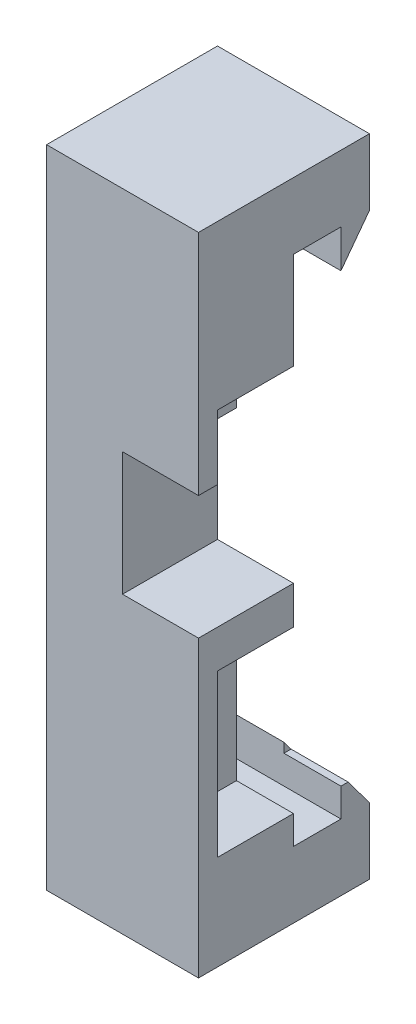
ISO-10303-21;
HEADER;
FILE_DESCRIPTION(('STEP AP214'),'2;1');
FILE_NAME('part.step','',(''),(''),'','','');
FILE_SCHEMA(('AUTOMOTIVE_DESIGN { 1 0 10303 214 1 1 1 1 }'));
ENDSEC;
DATA;
#1=APPLICATION_CONTEXT('core data for automotive mechanical design processes');
#2=APPLICATION_PROTOCOL_DEFINITION('international standard','automotive_design',2000,#1);
#3=PRODUCT_CONTEXT('',#1,'mechanical');
#4=PRODUCT('Part','Part','',(#3));
#5=PRODUCT_RELATED_PRODUCT_CATEGORY('part','',(#4));
#6=PRODUCT_DEFINITION_FORMATION('','',#4);
#7=PRODUCT_DEFINITION_CONTEXT('part definition',#1,'design');
#8=PRODUCT_DEFINITION('design','',#6,#7);
#9=PRODUCT_DEFINITION_SHAPE('','',#8);
#10=(LENGTH_UNIT() NAMED_UNIT(*) SI_UNIT(.MILLI.,.METRE.));
#11=(NAMED_UNIT(*) PLANE_ANGLE_UNIT() SI_UNIT($,.RADIAN.));
#12=(NAMED_UNIT(*) SI_UNIT($,.STERADIAN.) SOLID_ANGLE_UNIT());
#13=UNCERTAINTY_MEASURE_WITH_UNIT(LENGTH_MEASURE(1.E-05),#10,'distance_accuracy_value','');
#14=(GEOMETRIC_REPRESENTATION_CONTEXT(3) GLOBAL_UNCERTAINTY_ASSIGNED_CONTEXT((#13)) GLOBAL_UNIT_ASSIGNED_CONTEXT((#10,
#11,#12)) REPRESENTATION_CONTEXT('',''));
#15=CARTESIAN_POINT('',(0.,0.,0.));
#16=DIRECTION('',(0.,0.,1.));
#17=DIRECTION('',(1.,0.,0.));
#18=AXIS2_PLACEMENT_3D('',#15,#16,#17);
#19=CARTESIAN_POINT('',(2.5,3.75,0.));
#20=DIRECTION('',(-1.,0.,0.));
#21=DIRECTION('',(0.,0.,1.));
#22=AXIS2_PLACEMENT_3D('',#19,#20,#21);
#23=PLANE('',#22);
#24=DIRECTION('',(0.,0.,1.));
#25=VECTOR('',#24,1.);
#26=CARTESIAN_POINT('',(2.5,6.75,0.197224362268007));
#27=LINE('',#26,#25);
#28=CARTESIAN_POINT('',(2.5,6.75,2.));
#29=VERTEX_POINT('',#28);
#30=CARTESIAN_POINT('',(2.5,6.75,4.));
#31=VERTEX_POINT('',#30);
#32=EDGE_CURVE('E221',#29,#31,#27,.T.);
#33=ORIENTED_EDGE('',*,*,#32,.T.);
#34=DIRECTION('',(0.,-1.,0.));
#35=VECTOR('',#34,1.);
#36=CARTESIAN_POINT('',(2.5,3.75,4.));
#37=LINE('',#36,#35);
#38=CARTESIAN_POINT('',(2.5,2.5,4.));
#39=VERTEX_POINT('',#38);
#40=EDGE_CURVE('E269',#31,#39,#37,.T.);
#41=ORIENTED_EDGE('',*,*,#40,.T.);
#42=DIRECTION('',(0.,0.,1.));
#43=VECTOR('',#42,1.);
#44=CARTESIAN_POINT('',(2.5,2.5,0.));
#45=LINE('',#44,#43);
#46=CARTESIAN_POINT('',(2.5,2.5,2.));
#47=VERTEX_POINT('',#46);
#48=EDGE_CURVE('E344',#47,#39,#45,.T.);
#49=ORIENTED_EDGE('',*,*,#48,.F.);
#50=DIRECTION('',(0.,1.,0.));
#51=VECTOR('',#50,1.);
#52=CARTESIAN_POINT('',(2.5,3.75,2.));
#53=LINE('',#52,#51);
#54=EDGE_CURVE('E48',#47,#29,#53,.T.);
#55=ORIENTED_EDGE('',*,*,#54,.T.);
#56=EDGE_LOOP('',(#33,#41,#49,#55));
#57=FACE_BOUND('',#56,.T.);
#58=ADVANCED_FACE('F33',(#57),#23,.F.);
#59=CARTESIAN_POINT('',(2.,3.75,4.));
#60=DIRECTION('',(0.,0.,-1.));
#61=DIRECTION('',(-1.,0.,0.));
#62=AXIS2_PLACEMENT_3D('',#59,#60,#61);
#63=PLANE('',#62);
#64=ORIENTED_EDGE('',*,*,#40,.F.);
#65=DIRECTION('',(-1.,0.,0.));
#66=VECTOR('',#65,1.);
#67=CARTESIAN_POINT('',(2.5,6.75,4.));
#68=LINE('',#67,#66);
#69=CARTESIAN_POINT('',(4.,6.75,4.));
#70=VERTEX_POINT('',#69);
#71=EDGE_CURVE('E56',#70,#31,#68,.T.);
#72=ORIENTED_EDGE('',*,*,#71,.F.);
#73=DIRECTION('',(0.,1.,0.));
#74=VECTOR('',#73,1.);
#75=CARTESIAN_POINT('',(4.,3.75,4.));
#76=LINE('',#75,#74);
#77=CARTESIAN_POINT('',(4.,2.5,4.));
#78=VERTEX_POINT('',#77);
#79=EDGE_CURVE('E219',#78,#70,#76,.T.);
#80=ORIENTED_EDGE('',*,*,#79,.F.);
#81=DIRECTION('',(1.,0.,0.));
#82=VECTOR('',#81,1.);
#83=CARTESIAN_POINT('',(2.,2.5,4.));
#84=LINE('',#83,#82);
#85=EDGE_CURVE('E267',#39,#78,#84,.T.);
#86=ORIENTED_EDGE('',*,*,#85,.F.);
#87=EDGE_LOOP('',(#64,#72,#80,#86));
#88=FACE_BOUND('',#87,.T.);
#89=ADVANCED_FACE('F426',(#88),#63,.T.);
#90=CARTESIAN_POINT('',(4.,0.,6.));
#91=DIRECTION('',(-1.,0.,0.));
#92=DIRECTION('',(0.,0.,1.));
#93=AXIS2_PLACEMENT_3D('',#90,#91,#92);
#94=PLANE('',#93);
#95=DIRECTION('',(0.,0.,1.));
#96=VECTOR('',#95,1.);
#97=CARTESIAN_POINT('',(4.,7.75,0.));
#98=LINE('',#97,#96);
#99=CARTESIAN_POINT('',(4.,7.75,2.));
#100=VERTEX_POINT('',#99);
#101=CARTESIAN_POINT('',(4.,7.75,4.5));
#102=VERTEX_POINT('',#101);
#103=EDGE_CURVE('E345',#100,#102,#98,.T.);
#104=ORIENTED_EDGE('',*,*,#103,.T.);
#105=DIRECTION('',(0.,1.,0.));
#106=VECTOR('',#105,1.);
#107=CARTESIAN_POINT('',(4.,17.,4.5));
#108=LINE('',#107,#106);
#109=CARTESIAN_POINT('',(4.,0.,4.5));
#110=VERTEX_POINT('',#109);
#111=EDGE_CURVE('E227',#110,#102,#108,.T.);
#112=ORIENTED_EDGE('',*,*,#111,.F.);
#113=DIRECTION('',(0.,0.,-1.));
#114=VECTOR('',#113,1.);
#115=CARTESIAN_POINT('',(4.,0.,6.));
#116=LINE('',#115,#114);
#117=CARTESIAN_POINT('',(4.,0.,0.));
#118=VERTEX_POINT('',#117);
#119=EDGE_CURVE('E380',#110,#118,#116,.T.);
#120=ORIENTED_EDGE('',*,*,#119,.T.);
#121=DIRECTION('',(0.,1.,0.));
#122=VECTOR('',#121,1.);
#123=CARTESIAN_POINT('',(4.,0.,0.));
#124=LINE('',#123,#122);
#125=CARTESIAN_POINT('',(4.,1.75,0.));
#126=VERTEX_POINT('',#125);
#127=EDGE_CURVE('E370',#118,#126,#124,.T.);
#128=ORIENTED_EDGE('',*,*,#127,.T.);
#129=DIRECTION('',(0.,0.799999999999999,0.600000000000001));
#130=VECTOR('',#129,1.);
#131=CARTESIAN_POINT('',(4.,1.75,0.));
#132=LINE('',#131,#130);
#133=CARTESIAN_POINT('',(4.,2.5,0.562500000000002));
#134=VERTEX_POINT('',#133);
#135=EDGE_CURVE('E272',#126,#134,#132,.T.);
#136=ORIENTED_EDGE('',*,*,#135,.T.);
#137=DIRECTION('',(0.,0.,1.));
#138=VECTOR('',#137,1.);
#139=CARTESIAN_POINT('',(4.,2.5,0.));
#140=LINE('',#139,#138);
#141=CARTESIAN_POINT('',(4.,2.5,0.750000000000002));
#142=VERTEX_POINT('',#141);
#143=EDGE_CURVE('E357',#134,#142,#140,.T.);
#144=ORIENTED_EDGE('',*,*,#143,.T.);
#145=DIRECTION('',(0.,-1.,0.));
#146=VECTOR('',#145,1.);
#147=CARTESIAN_POINT('',(4.,2.75,0.750000000000002));
#148=LINE('',#147,#146);
#149=CARTESIAN_POINT('',(4.,1.75,0.750000000000002));
#150=VERTEX_POINT('',#149);
#151=EDGE_CURVE('E275',#142,#150,#148,.T.);
#152=ORIENTED_EDGE('',*,*,#151,.T.);
#153=DIRECTION('',(0.,0.,1.));
#154=VECTOR('',#153,1.);
#155=CARTESIAN_POINT('',(4.,1.75,0.750000000000002));
#156=LINE('',#155,#154);
#157=CARTESIAN_POINT('',(4.,1.75,2.));
#158=VERTEX_POINT('',#157);
#159=EDGE_CURVE('E279',#150,#158,#156,.T.);
#160=ORIENTED_EDGE('',*,*,#159,.T.);
#161=DIRECTION('',(0.,1.,0.));
#162=VECTOR('',#161,1.);
#163=CARTESIAN_POINT('',(4.,15.25,2.));
#164=LINE('',#163,#162);
#165=CARTESIAN_POINT('',(4.,2.5,2.));
#166=VERTEX_POINT('',#165);
#167=EDGE_CURVE('E283',#158,#166,#164,.T.);
#168=ORIENTED_EDGE('',*,*,#167,.T.);
#169=EDGE_CURVE('E358',#166,#78,#140,.T.);
#170=ORIENTED_EDGE('',*,*,#169,.T.);
#171=ORIENTED_EDGE('',*,*,#79,.T.);
#172=DIRECTION('',(0.,0.,1.));
#173=VECTOR('',#172,1.);
#174=CARTESIAN_POINT('',(4.,6.75,0.197224362268007));
#175=LINE('',#174,#173);
#176=CARTESIAN_POINT('',(4.,6.75,2.));
#177=VERTEX_POINT('',#176);
#178=EDGE_CURVE('E216',#177,#70,#175,.T.);
#179=ORIENTED_EDGE('',*,*,#178,.F.);
#180=DIRECTION('',(0.,1.,0.));
#181=VECTOR('',#180,1.);
#182=CARTESIAN_POINT('',(4.,7.75,2.));
#183=LINE('',#182,#181);
#184=EDGE_CURVE('E201',#177,#100,#183,.T.);
#185=ORIENTED_EDGE('',*,*,#184,.T.);
#186=EDGE_LOOP('',(#104,#112,#120,#128,#136,#144,#152,#160,#168,#170,#171,#179,#185));
#187=FACE_BOUND('',#186,.T.);
#188=ADVANCED_FACE('F217',(#187),#94,.F.);
#189=CARTESIAN_POINT('',(0.,0.,0.));
#190=DIRECTION('',(0.,0.,-1.));
#191=DIRECTION('',(-1.,0.,0.));
#192=AXIS2_PLACEMENT_3D('',#189,#190,#191);
#193=PLANE('',#192);
#194=DIRECTION('',(-1.,0.,0.));
#195=VECTOR('',#194,1.);
#196=CARTESIAN_POINT('',(4.,15.25,0.));
#197=LINE('',#196,#195);
#198=CARTESIAN_POINT('',(4.,15.25,0.));
#199=VERTEX_POINT('',#198);
#200=CARTESIAN_POINT('',(0.,15.25,0.));
#201=VERTEX_POINT('',#200);
#202=EDGE_CURVE('E314',#199,#201,#197,.T.);
#203=ORIENTED_EDGE('',*,*,#202,.T.);
#204=DIRECTION('',(0.,-1.,0.));
#205=VECTOR('',#204,1.);
#206=CARTESIAN_POINT('',(0.,0.,0.));
#207=LINE('',#206,#205);
#208=CARTESIAN_POINT('',(0.,17.,0.));
#209=VERTEX_POINT('',#208);
#210=EDGE_CURVE('E363',#209,#201,#207,.T.);
#211=ORIENTED_EDGE('',*,*,#210,.F.);
#212=DIRECTION('',(-1.,0.,0.));
#213=VECTOR('',#212,1.);
#214=CARTESIAN_POINT('',(0.,17.,0.));
#215=LINE('',#214,#213);
#216=CARTESIAN_POINT('',(4.,17.,0.));
#217=VERTEX_POINT('',#216);
#218=EDGE_CURVE('E373',#217,#209,#215,.T.);
#219=ORIENTED_EDGE('',*,*,#218,.F.);
#220=EDGE_CURVE('E369',#199,#217,#124,.T.);
#221=ORIENTED_EDGE('',*,*,#220,.F.);
#222=EDGE_LOOP('',(#203,#211,#219,#221));
#223=FACE_BOUND('',#222,.T.);
#224=ADVANCED_FACE('F449',(#223),#193,.T.);
#225=CARTESIAN_POINT('',(4.,2.5,0.));
#226=DIRECTION('',(0.,-1.,0.));
#227=DIRECTION('',(0.,0.,-1.));
#228=AXIS2_PLACEMENT_3D('',#225,#226,#227);
#229=PLANE('',#228);
#230=ORIENTED_EDGE('',*,*,#48,.T.);
#231=ORIENTED_EDGE('',*,*,#85,.T.);
#232=ORIENTED_EDGE('',*,*,#169,.F.);
#233=DIRECTION('',(-1.,0.,0.));
#234=VECTOR('',#233,1.);
#235=CARTESIAN_POINT('',(4.,2.5,2.));
#236=LINE('',#235,#234);
#237=EDGE_CURVE('E335',#166,#47,#236,.T.);
#238=ORIENTED_EDGE('',*,*,#237,.T.);
#239=EDGE_LOOP('',(#230,#231,#232,#238));
#240=FACE_BOUND('',#239,.T.);
#241=ADVANCED_FACE('F424',(#240),#229,.F.);
#242=CARTESIAN_POINT('',(0.,0.,6.));
#243=DIRECTION('',(1.,0.,0.));
#244=DIRECTION('',(0.,0.,-1.));
#245=AXIS2_PLACEMENT_3D('',#242,#243,#244);
#246=PLANE('',#245);
#247=DIRECTION('',(0.,0.,-1.));
#248=VECTOR('',#247,1.);
#249=CARTESIAN_POINT('',(0.,0.,6.));
#250=LINE('',#249,#248);
#251=CARTESIAN_POINT('',(0.,0.,4.5));
#252=VERTEX_POINT('',#251);
#253=CARTESIAN_POINT('',(0.,0.,0.));
#254=VERTEX_POINT('',#253);
#255=EDGE_CURVE('E382',#252,#254,#250,.T.);
#256=ORIENTED_EDGE('',*,*,#255,.F.);
#257=DIRECTION('',(0.,1.,0.));
#258=VECTOR('',#257,1.);
#259=CARTESIAN_POINT('',(0.,0.,4.5));
#260=LINE('',#259,#258);
#261=CARTESIAN_POINT('',(0.,17.,4.5));
#262=VERTEX_POINT('',#261);
#263=EDGE_CURVE('E240',#252,#262,#260,.T.);
#264=ORIENTED_EDGE('',*,*,#263,.T.);
#265=DIRECTION('',(0.,0.,-1.));
#266=VECTOR('',#265,1.);
#267=CARTESIAN_POINT('',(0.,17.,6.));
#268=LINE('',#267,#266);
#269=EDGE_CURVE('E376',#262,#209,#268,.T.);
#270=ORIENTED_EDGE('',*,*,#269,.T.);
#271=ORIENTED_EDGE('',*,*,#210,.T.);
#272=DIRECTION('',(0.,0.799999999999999,-0.600000000000001));
#273=VECTOR('',#272,1.);
#274=CARTESIAN_POINT('',(0.,15.25,0.));
#275=LINE('',#274,#273);
#276=CARTESIAN_POINT('',(0.,14.25,0.750000000000002));
#277=VERTEX_POINT('',#276);
#278=EDGE_CURVE('E276',#277,#201,#275,.T.);
#279=ORIENTED_EDGE('',*,*,#278,.F.);
#280=DIRECTION('',(0.,-1.,0.));
#281=VECTOR('',#280,1.);
#282=CARTESIAN_POINT('',(0.,14.25,0.750000000000002));
#283=LINE('',#282,#281);
#284=CARTESIAN_POINT('',(0.,15.25,0.750000000000002));
#285=VERTEX_POINT('',#284);
#286=EDGE_CURVE('E310',#285,#277,#283,.T.);
#287=ORIENTED_EDGE('',*,*,#286,.F.);
#288=DIRECTION('',(0.,0.,-1.));
#289=VECTOR('',#288,1.);
#290=CARTESIAN_POINT('',(0.,15.25,0.750000000000002));
#291=LINE('',#290,#289);
#292=CARTESIAN_POINT('',(0.,15.25,2.));
#293=VERTEX_POINT('',#292);
#294=EDGE_CURVE('E307',#293,#285,#291,.T.);
#295=ORIENTED_EDGE('',*,*,#294,.F.);
#296=DIRECTION('',(0.,1.,0.));
#297=VECTOR('',#296,1.);
#298=CARTESIAN_POINT('',(0.,15.25,2.));
#299=LINE('',#298,#297);
#300=CARTESIAN_POINT('',(0.,1.75,2.));
#301=VERTEX_POINT('',#300);
#302=EDGE_CURVE('E304',#301,#293,#299,.T.);
#303=ORIENTED_EDGE('',*,*,#302,.F.);
#304=DIRECTION('',(0.,0.,1.));
#305=VECTOR('',#304,1.);
#306=CARTESIAN_POINT('',(0.,1.75,0.750000000000002));
#307=LINE('',#306,#305);
#308=CARTESIAN_POINT('',(0.,1.75,0.750000000000002));
#309=VERTEX_POINT('',#308);
#310=EDGE_CURVE('E301',#309,#301,#307,.T.);
#311=ORIENTED_EDGE('',*,*,#310,.F.);
#312=DIRECTION('',(0.,-1.,0.));
#313=VECTOR('',#312,1.);
#314=CARTESIAN_POINT('',(0.,2.75,0.750000000000002));
#315=LINE('',#314,#313);
#316=CARTESIAN_POINT('',(0.,2.75,0.750000000000002));
#317=VERTEX_POINT('',#316);
#318=EDGE_CURVE('E298',#317,#309,#315,.T.);
#319=ORIENTED_EDGE('',*,*,#318,.F.);
#320=DIRECTION('',(0.,0.799999999999999,0.600000000000001));
#321=VECTOR('',#320,1.);
#322=CARTESIAN_POINT('',(0.,1.75,0.));
#323=LINE('',#322,#321);
#324=CARTESIAN_POINT('',(0.,1.75,0.));
#325=VERTEX_POINT('',#324);
#326=EDGE_CURVE('E271',#325,#317,#323,.T.);
#327=ORIENTED_EDGE('',*,*,#326,.F.);
#328=EDGE_CURVE('E347',#325,#254,#207,.T.);
#329=ORIENTED_EDGE('',*,*,#328,.T.);
#330=EDGE_LOOP('',(#256,#264,#270,#271,#279,#287,#295,#303,#311,#319,#327,#329));
#331=FACE_BOUND('',#330,.T.);
#332=ADVANCED_FACE('F35',(#331),#246,.F.);
#333=CARTESIAN_POINT('',(0.,0.,6.));
#334=DIRECTION('',(0.,1.,0.));
#335=DIRECTION('',(0.,0.,1.));
#336=AXIS2_PLACEMENT_3D('',#333,#334,#335);
#337=PLANE('',#336);
#338=ORIENTED_EDGE('',*,*,#119,.F.);
#339=DIRECTION('',(1.,0.,0.));
#340=VECTOR('',#339,1.);
#341=CARTESIAN_POINT('',(-6.,0.,4.5));
#342=LINE('',#341,#340);
#343=EDGE_CURVE('E230',#252,#110,#342,.T.);
#344=ORIENTED_EDGE('',*,*,#343,.F.);
#345=ORIENTED_EDGE('',*,*,#255,.T.);
#346=DIRECTION('',(1.,0.,0.));
#347=VECTOR('',#346,1.);
#348=CARTESIAN_POINT('',(0.,0.,0.));
#349=LINE('',#348,#347);
#350=EDGE_CURVE('E366',#254,#118,#349,.T.);
#351=ORIENTED_EDGE('',*,*,#350,.T.);
#352=EDGE_LOOP('',(#338,#344,#345,#351));
#353=FACE_BOUND('',#352,.T.);
#354=ADVANCED_FACE('F456',(#353),#337,.F.);
#355=DIRECTION('',(0.,0.,-1.));
#356=VECTOR('',#355,1.);
#357=CARTESIAN_POINT('',(4.,17.,6.));
#358=LINE('',#357,#356);
#359=CARTESIAN_POINT('',(4.,17.,4.5));
#360=VERTEX_POINT('',#359);
#361=EDGE_CURVE('E378',#360,#217,#358,.T.);
#362=ORIENTED_EDGE('',*,*,#361,.F.);
#363=CARTESIAN_POINT('',(4.,11.,4.5));
#364=VERTEX_POINT('',#363);
#365=EDGE_CURVE('E213',#364,#360,#108,.T.);
#366=ORIENTED_EDGE('',*,*,#365,.F.);
#367=DIRECTION('',(0.,0.,1.));
#368=VECTOR('',#367,1.);
#369=CARTESIAN_POINT('',(4.,11.,0.));
#370=LINE('',#369,#368);
#371=CARTESIAN_POINT('',(4.,11.,4.));
#372=VERTEX_POINT('',#371);
#373=EDGE_CURVE('E354',#372,#364,#370,.T.);
#374=ORIENTED_EDGE('',*,*,#373,.F.);
#375=DIRECTION('',(0.,-1.,0.));
#376=VECTOR('',#375,1.);
#377=CARTESIAN_POINT('',(4.,11.,4.));
#378=LINE('',#377,#376);
#379=CARTESIAN_POINT('',(4.,12.7,4.));
#380=VERTEX_POINT('',#379);
#381=EDGE_CURVE('E244',#380,#372,#378,.T.);
#382=ORIENTED_EDGE('',*,*,#381,.F.);
#383=DIRECTION('',(0.,0.,-1.));
#384=VECTOR('',#383,1.);
#385=CARTESIAN_POINT('',(4.,12.7,4.));
#386=LINE('',#385,#384);
#387=CARTESIAN_POINT('',(4.,12.7,2.));
#388=VERTEX_POINT('',#387);
#389=EDGE_CURVE('E260',#380,#388,#386,.T.);
#390=ORIENTED_EDGE('',*,*,#389,.T.);
#391=CARTESIAN_POINT('',(4.,15.25,2.));
#392=VERTEX_POINT('',#391);
#393=EDGE_CURVE('E282',#388,#392,#164,.T.);
#394=ORIENTED_EDGE('',*,*,#393,.T.);
#395=DIRECTION('',(0.,0.,-1.));
#396=VECTOR('',#395,1.);
#397=CARTESIAN_POINT('',(4.,15.25,0.750000000000002));
#398=LINE('',#397,#396);
#399=CARTESIAN_POINT('',(4.,15.25,0.750000000000002));
#400=VERTEX_POINT('',#399);
#401=EDGE_CURVE('E286',#392,#400,#398,.T.);
#402=ORIENTED_EDGE('',*,*,#401,.T.);
#403=DIRECTION('',(0.,-1.,0.));
#404=VECTOR('',#403,1.);
#405=CARTESIAN_POINT('',(4.,14.25,0.750000000000002));
#406=LINE('',#405,#404);
#407=CARTESIAN_POINT('',(4.,14.25,0.750000000000002));
#408=VERTEX_POINT('',#407);
#409=EDGE_CURVE('E289',#400,#408,#406,.T.);
#410=ORIENTED_EDGE('',*,*,#409,.T.);
#411=DIRECTION('',(0.,0.799999999999999,-0.600000000000001));
#412=VECTOR('',#411,1.);
#413=CARTESIAN_POINT('',(4.,15.25,0.));
#414=LINE('',#413,#412);
#415=EDGE_CURVE('E292',#408,#199,#414,.T.);
#416=ORIENTED_EDGE('',*,*,#415,.T.);
#417=ORIENTED_EDGE('',*,*,#220,.T.);
#418=EDGE_LOOP('',(#362,#366,#374,#382,#390,#394,#402,#410,#416,#417));
#419=FACE_BOUND('',#418,.T.);
#420=ADVANCED_FACE('F462',(#419),#94,.F.);
#421=CARTESIAN_POINT('',(0.,17.,6.));
#422=DIRECTION('',(0.,-1.,0.));
#423=DIRECTION('',(0.,0.,-1.));
#424=AXIS2_PLACEMENT_3D('',#421,#422,#423);
#425=PLANE('',#424);
#426=ORIENTED_EDGE('',*,*,#269,.F.);
#427=DIRECTION('',(1.,0.,0.));
#428=VECTOR('',#427,1.);
#429=CARTESIAN_POINT('',(-6.,17.,4.5));
#430=LINE('',#429,#428);
#431=EDGE_CURVE('E229',#262,#360,#430,.T.);
#432=ORIENTED_EDGE('',*,*,#431,.T.);
#433=ORIENTED_EDGE('',*,*,#361,.T.);
#434=ORIENTED_EDGE('',*,*,#218,.T.);
#435=EDGE_LOOP('',(#426,#432,#433,#434));
#436=FACE_BOUND('',#435,.T.);
#437=ADVANCED_FACE('F448',(#436),#425,.F.);
#438=DIRECTION('',(-1.,0.,0.));
#439=VECTOR('',#438,1.);
#440=CARTESIAN_POINT('',(4.,1.75,0.));
#441=LINE('',#440,#439);
#442=EDGE_CURVE('E295',#126,#325,#441,.T.);
#443=ORIENTED_EDGE('',*,*,#442,.F.);
#444=ORIENTED_EDGE('',*,*,#127,.F.);
#445=ORIENTED_EDGE('',*,*,#350,.F.);
#446=ORIENTED_EDGE('',*,*,#328,.F.);
#447=EDGE_LOOP('',(#443,#444,#445,#446));
#448=FACE_BOUND('',#447,.T.);
#449=ADVANCED_FACE('F408',(#448),#193,.T.);
#450=CARTESIAN_POINT('',(2.5,2.5,0.562500000000002));
#451=VERTEX_POINT('',#450);
#452=CARTESIAN_POINT('',(2.5,2.5,0.750000000000002));
#453=VERTEX_POINT('',#452);
#454=EDGE_CURVE('E360',#451,#453,#45,.T.);
#455=ORIENTED_EDGE('',*,*,#454,.T.);
#456=DIRECTION('',(1.,0.,0.));
#457=VECTOR('',#456,1.);
#458=CARTESIAN_POINT('',(4.,2.5,0.750000000000002));
#459=LINE('',#458,#457);
#460=EDGE_CURVE('E341',#453,#142,#459,.T.);
#461=ORIENTED_EDGE('',*,*,#460,.T.);
#462=ORIENTED_EDGE('',*,*,#143,.F.);
#463=DIRECTION('',(-1.,0.,0.));
#464=VECTOR('',#463,1.);
#465=CARTESIAN_POINT('',(4.,2.5,0.562500000000002));
#466=LINE('',#465,#464);
#467=EDGE_CURVE('E338',#134,#451,#466,.T.);
#468=ORIENTED_EDGE('',*,*,#467,.T.);
#469=EDGE_LOOP('',(#455,#461,#462,#468));
#470=FACE_BOUND('',#469,.T.);
#471=ADVANCED_FACE('F397',(#470),#229,.F.);
#472=DIRECTION('',(0.,0.799999999999999,0.600000000000001));
#473=VECTOR('',#472,1.);
#474=CARTESIAN_POINT('',(2.5,3.03,0.960000000000001));
#475=LINE('',#474,#473);
#476=CARTESIAN_POINT('',(2.5,2.75,0.750000000000002));
#477=VERTEX_POINT('',#476);
#478=EDGE_CURVE('E387',#451,#477,#475,.T.);
#479=ORIENTED_EDGE('',*,*,#478,.T.);
#480=DIRECTION('',(0.,-1.,0.));
#481=VECTOR('',#480,1.);
#482=CARTESIAN_POINT('',(2.5,3.75,0.750000000000002));
#483=LINE('',#482,#481);
#484=EDGE_CURVE('E41',#477,#453,#483,.T.);
#485=ORIENTED_EDGE('',*,*,#484,.T.);
#486=ORIENTED_EDGE('',*,*,#454,.F.);
#487=EDGE_LOOP('',(#479,#485,#486));
#488=FACE_BOUND('',#487,.T.);
#489=ADVANCED_FACE('F393',(#488),#23,.F.);
#490=CARTESIAN_POINT('',(4.,7.75,0.));
#491=DIRECTION('',(0.,-1.,0.));
#492=DIRECTION('',(1.,0.,0.));
#493=AXIS2_PLACEMENT_3D('',#490,#491,#492);
#494=PLANE('',#493);
#495=ORIENTED_EDGE('',*,*,#103,.F.);
#496=DIRECTION('',(-1.,0.,0.));
#497=VECTOR('',#496,1.);
#498=CARTESIAN_POINT('',(4.,7.75,2.));
#499=LINE('',#498,#497);
#500=CARTESIAN_POINT('',(2.,7.75,2.));
#501=VERTEX_POINT('',#500);
#502=EDGE_CURVE('E209',#100,#501,#499,.T.);
#503=ORIENTED_EDGE('',*,*,#502,.T.);
#504=DIRECTION('',(0.,0.,1.));
#505=VECTOR('',#504,1.);
#506=CARTESIAN_POINT('',(2.,7.75,0.));
#507=LINE('',#506,#505);
#508=CARTESIAN_POINT('',(2.,7.75,4.5));
#509=VERTEX_POINT('',#508);
#510=EDGE_CURVE('E348',#501,#509,#507,.T.);
#511=ORIENTED_EDGE('',*,*,#510,.T.);
#512=DIRECTION('',(1.,0.,0.));
#513=VECTOR('',#512,1.);
#514=CARTESIAN_POINT('',(4.,7.75,4.5));
#515=LINE('',#514,#513);
#516=EDGE_CURVE('E237',#509,#102,#515,.T.);
#517=ORIENTED_EDGE('',*,*,#516,.T.);
#518=EDGE_LOOP('',(#495,#503,#511,#517));
#519=FACE_BOUND('',#518,.T.);
#520=ADVANCED_FACE('F437',(#519),#494,.F.);
#521=CARTESIAN_POINT('',(2.,11.,0.));
#522=DIRECTION('',(-1.,0.,0.));
#523=DIRECTION('',(0.,-1.,0.));
#524=AXIS2_PLACEMENT_3D('',#521,#522,#523);
#525=PLANE('',#524);
#526=DIRECTION('',(0.,0.,1.));
#527=VECTOR('',#526,1.);
#528=CARTESIAN_POINT('',(2.,11.,0.));
#529=LINE('',#528,#527);
#530=CARTESIAN_POINT('',(2.,11.,2.));
#531=VERTEX_POINT('',#530);
#532=CARTESIAN_POINT('',(2.,11.,4.5));
#533=VERTEX_POINT('',#532);
#534=EDGE_CURVE('E351',#531,#533,#529,.T.);
#535=ORIENTED_EDGE('',*,*,#534,.T.);
#536=DIRECTION('',(0.,-1.,0.));
#537=VECTOR('',#536,1.);
#538=CARTESIAN_POINT('',(2.,11.,4.5));
#539=LINE('',#538,#537);
#540=EDGE_CURVE('E232',#533,#509,#539,.T.);
#541=ORIENTED_EDGE('',*,*,#540,.T.);
#542=ORIENTED_EDGE('',*,*,#510,.F.);
#543=DIRECTION('',(0.,1.,0.));
#544=VECTOR('',#543,1.);
#545=CARTESIAN_POINT('',(2.,11.,2.));
#546=LINE('',#545,#544);
#547=EDGE_CURVE('E317',#501,#531,#546,.T.);
#548=ORIENTED_EDGE('',*,*,#547,.T.);
#549=EDGE_LOOP('',(#535,#541,#542,#548));
#550=FACE_BOUND('',#549,.T.);
#551=ADVANCED_FACE('F442',(#550),#525,.F.);
#552=CARTESIAN_POINT('',(4.,11.,0.));
#553=DIRECTION('',(0.,1.,0.));
#554=DIRECTION('',(0.,0.,1.));
#555=AXIS2_PLACEMENT_3D('',#552,#553,#554);
#556=PLANE('',#555);
#557=ORIENTED_EDGE('',*,*,#373,.T.);
#558=DIRECTION('',(-1.,0.,0.));
#559=VECTOR('',#558,1.);
#560=CARTESIAN_POINT('',(4.,11.,4.5));
#561=LINE('',#560,#559);
#562=EDGE_CURVE('E11',#364,#533,#561,.T.);
#563=ORIENTED_EDGE('',*,*,#562,.T.);
#564=ORIENTED_EDGE('',*,*,#534,.F.);
#565=DIRECTION('',(1.,0.,0.));
#566=VECTOR('',#565,1.);
#567=CARTESIAN_POINT('',(4.,11.,2.));
#568=LINE('',#567,#566);
#569=CARTESIAN_POINT('',(2.5,11.,2.));
#570=VERTEX_POINT('',#569);
#571=EDGE_CURVE('E384',#531,#570,#568,.T.);
#572=ORIENTED_EDGE('',*,*,#571,.T.);
#573=DIRECTION('',(0.,0.,-1.));
#574=VECTOR('',#573,1.);
#575=CARTESIAN_POINT('',(2.5,11.,4.));
#576=LINE('',#575,#574);
#577=CARTESIAN_POINT('',(2.5,11.,4.));
#578=VERTEX_POINT('',#577);
#579=EDGE_CURVE('E256',#578,#570,#576,.T.);
#580=ORIENTED_EDGE('',*,*,#579,.F.);
#581=DIRECTION('',(-1.,0.,0.));
#582=VECTOR('',#581,1.);
#583=CARTESIAN_POINT('',(4.,11.,4.));
#584=LINE('',#583,#582);
#585=EDGE_CURVE('E246',#372,#578,#584,.T.);
#586=ORIENTED_EDGE('',*,*,#585,.F.);
#587=EDGE_LOOP('',(#557,#563,#564,#572,#580,#586));
#588=FACE_BOUND('',#587,.T.);
#589=ADVANCED_FACE('F508',(#588),#556,.F.);
#590=CARTESIAN_POINT('',(4.,2.75,0.750000000000002));
#591=DIRECTION('',(0.,0.,-1.));
#592=DIRECTION('',(-1.,0.,0.));
#593=AXIS2_PLACEMENT_3D('',#590,#591,#592);
#594=PLANE('',#593);
#595=ORIENTED_EDGE('',*,*,#484,.F.);
#596=DIRECTION('',(-1.,0.,0.));
#597=VECTOR('',#596,1.);
#598=CARTESIAN_POINT('',(4.,2.75,0.750000000000002));
#599=LINE('',#598,#597);
#600=EDGE_CURVE('E328',#477,#317,#599,.T.);
#601=ORIENTED_EDGE('',*,*,#600,.T.);
#602=ORIENTED_EDGE('',*,*,#318,.T.);
#603=DIRECTION('',(-1.,0.,0.));
#604=VECTOR('',#603,1.);
#605=CARTESIAN_POINT('',(4.,1.75,0.750000000000002));
#606=LINE('',#605,#604);
#607=EDGE_CURVE('E326',#150,#309,#606,.T.);
#608=ORIENTED_EDGE('',*,*,#607,.F.);
#609=ORIENTED_EDGE('',*,*,#151,.F.);
#610=ORIENTED_EDGE('',*,*,#460,.F.);
#611=EDGE_LOOP('',(#595,#601,#602,#608,#609,#610));
#612=FACE_BOUND('',#611,.T.);
#613=ADVANCED_FACE('F417',(#612),#594,.F.);
#614=CARTESIAN_POINT('',(4.,1.75,0.));
#615=DIRECTION('',(0.,-0.600000000000001,0.799999999999999));
#616=DIRECTION('',(0.,-0.799999999999999,-0.600000000000001));
#617=AXIS2_PLACEMENT_3D('',#614,#615,#616);
#618=PLANE('',#617);
#619=ORIENTED_EDGE('',*,*,#135,.F.);
#620=ORIENTED_EDGE('',*,*,#442,.T.);
#621=ORIENTED_EDGE('',*,*,#326,.T.);
#622=ORIENTED_EDGE('',*,*,#600,.F.);
#623=ORIENTED_EDGE('',*,*,#478,.F.);
#624=ORIENTED_EDGE('',*,*,#467,.F.);
#625=EDGE_LOOP('',(#619,#620,#621,#622,#623,#624));
#626=FACE_BOUND('',#625,.T.);
#627=ADVANCED_FACE('F401',(#626),#618,.F.);
#628=CARTESIAN_POINT('',(4.,15.25,2.));
#629=DIRECTION('',(0.,0.,1.));
#630=DIRECTION('',(1.,0.,0.));
#631=AXIS2_PLACEMENT_3D('',#628,#629,#630);
#632=PLANE('',#631);
#633=ORIENTED_EDGE('',*,*,#393,.F.);
#634=DIRECTION('',(1.,0.,0.));
#635=VECTOR('',#634,1.);
#636=CARTESIAN_POINT('',(4.,12.7,2.));
#637=LINE('',#636,#635);
#638=CARTESIAN_POINT('',(2.5,12.7,2.));
#639=VERTEX_POINT('',#638);
#640=EDGE_CURVE('E247',#639,#388,#637,.T.);
#641=ORIENTED_EDGE('',*,*,#640,.F.);
#642=DIRECTION('',(0.,1.,0.));
#643=VECTOR('',#642,1.);
#644=CARTESIAN_POINT('',(2.5,11.,2.));
#645=LINE('',#644,#643);
#646=EDGE_CURVE('E243',#570,#639,#645,.T.);
#647=ORIENTED_EDGE('',*,*,#646,.F.);
#648=ORIENTED_EDGE('',*,*,#571,.F.);
#649=ORIENTED_EDGE('',*,*,#547,.F.);
#650=ORIENTED_EDGE('',*,*,#502,.F.);
#651=ORIENTED_EDGE('',*,*,#184,.F.);
#652=DIRECTION('',(1.,0.,0.));
#653=VECTOR('',#652,1.);
#654=CARTESIAN_POINT('',(2.5,6.75,2.));
#655=LINE('',#654,#653);
#656=EDGE_CURVE('E206',#29,#177,#655,.T.);
#657=ORIENTED_EDGE('',*,*,#656,.F.);
#658=ORIENTED_EDGE('',*,*,#54,.F.);
#659=ORIENTED_EDGE('',*,*,#237,.F.);
#660=ORIENTED_EDGE('',*,*,#167,.F.);
#661=DIRECTION('',(-1.,0.,0.));
#662=VECTOR('',#661,1.);
#663=CARTESIAN_POINT('',(4.,1.75,2.));
#664=LINE('',#663,#662);
#665=EDGE_CURVE('E324',#158,#301,#664,.T.);
#666=ORIENTED_EDGE('',*,*,#665,.T.);
#667=ORIENTED_EDGE('',*,*,#302,.T.);
#668=DIRECTION('',(-1.,0.,0.));
#669=VECTOR('',#668,1.);
#670=CARTESIAN_POINT('',(4.,15.25,2.));
#671=LINE('',#670,#669);
#672=EDGE_CURVE('E322',#392,#293,#671,.T.);
#673=ORIENTED_EDGE('',*,*,#672,.F.);
#674=EDGE_LOOP('',(#633,#641,#647,#648,#649,#650,#651,#657,#658,#659,#660,#666,#667,#673));
#675=FACE_BOUND('',#674,.T.);
#676=ADVANCED_FACE('F204',(#675),#632,.F.);
#677=CARTESIAN_POINT('',(4.,15.25,0.));
#678=DIRECTION('',(0.,0.600000000000001,0.799999999999999));
#679=DIRECTION('',(0.,-0.799999999999999,0.600000000000001));
#680=AXIS2_PLACEMENT_3D('',#677,#678,#679);
#681=PLANE('',#680);
#682=ORIENTED_EDGE('',*,*,#278,.T.);
#683=ORIENTED_EDGE('',*,*,#202,.F.);
#684=ORIENTED_EDGE('',*,*,#415,.F.);
#685=DIRECTION('',(-1.,0.,0.));
#686=VECTOR('',#685,1.);
#687=CARTESIAN_POINT('',(4.,14.25,0.750000000000002));
#688=LINE('',#687,#686);
#689=EDGE_CURVE('E318',#408,#277,#688,.T.);
#690=ORIENTED_EDGE('',*,*,#689,.T.);
#691=EDGE_LOOP('',(#682,#683,#684,#690));
#692=FACE_BOUND('',#691,.T.);
#693=ADVANCED_FACE('F484',(#692),#681,.F.);
#694=CARTESIAN_POINT('',(4.,14.25,0.750000000000002));
#695=DIRECTION('',(0.,0.,-1.));
#696=DIRECTION('',(-1.,0.,0.));
#697=AXIS2_PLACEMENT_3D('',#694,#695,#696);
#698=PLANE('',#697);
#699=ORIENTED_EDGE('',*,*,#286,.T.);
#700=ORIENTED_EDGE('',*,*,#689,.F.);
#701=ORIENTED_EDGE('',*,*,#409,.F.);
#702=DIRECTION('',(-1.,0.,0.));
#703=VECTOR('',#702,1.);
#704=CARTESIAN_POINT('',(4.,15.25,0.750000000000002));
#705=LINE('',#704,#703);
#706=EDGE_CURVE('E320',#400,#285,#705,.T.);
#707=ORIENTED_EDGE('',*,*,#706,.T.);
#708=EDGE_LOOP('',(#699,#700,#701,#707));
#709=FACE_BOUND('',#708,.T.);
#710=ADVANCED_FACE('F488',(#709),#698,.F.);
#711=CARTESIAN_POINT('',(4.,15.25,0.750000000000002));
#712=DIRECTION('',(0.,1.,0.));
#713=DIRECTION('',(0.,0.,1.));
#714=AXIS2_PLACEMENT_3D('',#711,#712,#713);
#715=PLANE('',#714);
#716=ORIENTED_EDGE('',*,*,#294,.T.);
#717=ORIENTED_EDGE('',*,*,#706,.F.);
#718=ORIENTED_EDGE('',*,*,#401,.F.);
#719=ORIENTED_EDGE('',*,*,#672,.T.);
#720=EDGE_LOOP('',(#716,#717,#718,#719));
#721=FACE_BOUND('',#720,.T.);
#722=ADVANCED_FACE('F491',(#721),#715,.F.);
#723=CARTESIAN_POINT('',(4.,1.75,0.750000000000002));
#724=DIRECTION('',(0.,-1.,0.));
#725=DIRECTION('',(0.,0.,-1.));
#726=AXIS2_PLACEMENT_3D('',#723,#724,#725);
#727=PLANE('',#726);
#728=ORIENTED_EDGE('',*,*,#310,.T.);
#729=ORIENTED_EDGE('',*,*,#665,.F.);
#730=ORIENTED_EDGE('',*,*,#159,.F.);
#731=ORIENTED_EDGE('',*,*,#607,.T.);
#732=EDGE_LOOP('',(#728,#729,#730,#731));
#733=FACE_BOUND('',#732,.T.);
#734=ADVANCED_FACE('F420',(#733),#727,.F.);
#735=CARTESIAN_POINT('',(4.,12.7,4.));
#736=DIRECTION('',(0.,1.,0.));
#737=DIRECTION('',(0.,0.,1.));
#738=AXIS2_PLACEMENT_3D('',#735,#736,#737);
#739=PLANE('',#738);
#740=ORIENTED_EDGE('',*,*,#640,.T.);
#741=ORIENTED_EDGE('',*,*,#389,.F.);
#742=DIRECTION('',(1.,0.,0.));
#743=VECTOR('',#742,1.);
#744=CARTESIAN_POINT('',(4.,12.7,4.));
#745=LINE('',#744,#743);
#746=CARTESIAN_POINT('',(2.5,12.7,4.));
#747=VERTEX_POINT('',#746);
#748=EDGE_CURVE('E253',#747,#380,#745,.T.);
#749=ORIENTED_EDGE('',*,*,#748,.F.);
#750=DIRECTION('',(0.,0.,-1.));
#751=VECTOR('',#750,1.);
#752=CARTESIAN_POINT('',(2.5,12.7,4.));
#753=LINE('',#752,#751);
#754=EDGE_CURVE('E263',#747,#639,#753,.T.);
#755=ORIENTED_EDGE('',*,*,#754,.T.);
#756=EDGE_LOOP('',(#740,#741,#749,#755));
#757=FACE_BOUND('',#756,.T.);
#758=ADVANCED_FACE('F498',(#757),#739,.F.);
#759=CARTESIAN_POINT('',(2.5,11.,4.));
#760=DIRECTION('',(-1.,0.,0.));
#761=DIRECTION('',(0.,0.,1.));
#762=AXIS2_PLACEMENT_3D('',#759,#760,#761);
#763=PLANE('',#762);
#764=ORIENTED_EDGE('',*,*,#646,.T.);
#765=ORIENTED_EDGE('',*,*,#754,.F.);
#766=DIRECTION('',(0.,1.,0.));
#767=VECTOR('',#766,1.);
#768=CARTESIAN_POINT('',(2.5,11.,4.));
#769=LINE('',#768,#767);
#770=EDGE_CURVE('E250',#578,#747,#769,.T.);
#771=ORIENTED_EDGE('',*,*,#770,.F.);
#772=ORIENTED_EDGE('',*,*,#579,.T.);
#773=EDGE_LOOP('',(#764,#765,#771,#772));
#774=FACE_BOUND('',#773,.T.);
#775=ADVANCED_FACE('F504',(#774),#763,.F.);
#776=CARTESIAN_POINT('',(0.,0.,4.));
#777=DIRECTION('',(0.,0.,1.));
#778=DIRECTION('',(1.,0.,0.));
#779=AXIS2_PLACEMENT_3D('',#776,#777,#778);
#780=PLANE('',#779);
#781=ORIENTED_EDGE('',*,*,#381,.T.);
#782=ORIENTED_EDGE('',*,*,#585,.T.);
#783=ORIENTED_EDGE('',*,*,#770,.T.);
#784=ORIENTED_EDGE('',*,*,#748,.T.);
#785=EDGE_LOOP('',(#781,#782,#783,#784));
#786=FACE_BOUND('',#785,.T.);
#787=ADVANCED_FACE('F500',(#786),#780,.F.);
#788=CARTESIAN_POINT('',(-6.,17.,4.5));
#789=DIRECTION('',(0.,0.,-1.));
#790=DIRECTION('',(0.,1.,0.));
#791=AXIS2_PLACEMENT_3D('',#788,#789,#790);
#792=PLANE('',#791);
#793=ORIENTED_EDGE('',*,*,#343,.T.);
#794=ORIENTED_EDGE('',*,*,#111,.T.);
#795=ORIENTED_EDGE('',*,*,#516,.F.);
#796=ORIENTED_EDGE('',*,*,#540,.F.);
#797=ORIENTED_EDGE('',*,*,#562,.F.);
#798=ORIENTED_EDGE('',*,*,#365,.T.);
#799=ORIENTED_EDGE('',*,*,#431,.F.);
#800=ORIENTED_EDGE('',*,*,#263,.F.);
#801=EDGE_LOOP('',(#793,#794,#795,#796,#797,#798,#799,#800));
#802=FACE_BOUND('',#801,.T.);
#803=ADVANCED_FACE('F511',(#802),#792,.F.);
#804=CARTESIAN_POINT('',(2.5,6.75,0.197224362268007));
#805=DIRECTION('',(0.,1.,0.));
#806=DIRECTION('',(-1.,0.,0.));
#807=AXIS2_PLACEMENT_3D('',#804,#805,#806);
#808=PLANE('',#807);
#809=ORIENTED_EDGE('',*,*,#32,.F.);
#810=ORIENTED_EDGE('',*,*,#656,.T.);
#811=ORIENTED_EDGE('',*,*,#178,.T.);
#812=ORIENTED_EDGE('',*,*,#71,.T.);
#813=EDGE_LOOP('',(#809,#810,#811,#812));
#814=FACE_BOUND('',#813,.T.);
#815=ADVANCED_FACE('F223',(#814),#808,.F.);
#816=CLOSED_SHELL('',(#58,#89,#188,#224,#241,#332,#354,#420,#437,#449,#471,#489,#520,#551,#589,
#613,#627,#676,#693,#710,#722,#734,#758,#775,#787,#803,#815));
#817=MANIFOLD_SOLID_BREP('B2',#816);
#818=ADVANCED_BREP_SHAPE_REPRESENTATION('',(#18,#817),#14);
#819=SHAPE_DEFINITION_REPRESENTATION(#9,#818);
ENDSEC;
END-ISO-10303-21;
